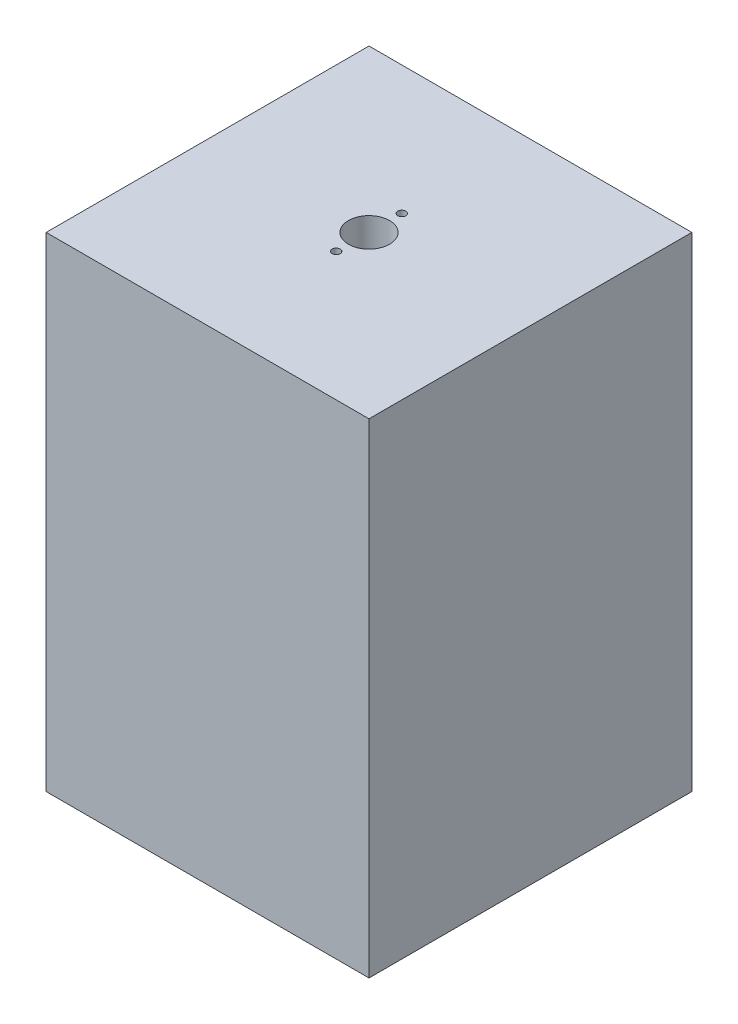
ISO-10303-21;
HEADER;
FILE_DESCRIPTION(('STEP AP214'),'2;1');
FILE_NAME('part.step','',(''),(''),'','','');
FILE_SCHEMA(('AUTOMOTIVE_DESIGN { 1 0 10303 214 1 1 1 1 }'));
ENDSEC;
DATA;
#1=APPLICATION_CONTEXT('core data for automotive mechanical design processes');
#2=APPLICATION_PROTOCOL_DEFINITION('international standard','automotive_design',2000,#1);
#3=PRODUCT_CONTEXT('',#1,'mechanical');
#4=PRODUCT('Part','Part','',(#3));
#5=PRODUCT_RELATED_PRODUCT_CATEGORY('part','',(#4));
#6=PRODUCT_DEFINITION_FORMATION('','',#4);
#7=PRODUCT_DEFINITION_CONTEXT('part definition',#1,'design');
#8=PRODUCT_DEFINITION('design','',#6,#7);
#9=PRODUCT_DEFINITION_SHAPE('','',#8);
#10=(LENGTH_UNIT() NAMED_UNIT(*) SI_UNIT(.MILLI.,.METRE.));
#11=(NAMED_UNIT(*) PLANE_ANGLE_UNIT() SI_UNIT($,.RADIAN.));
#12=(NAMED_UNIT(*) SI_UNIT($,.STERADIAN.) SOLID_ANGLE_UNIT());
#13=UNCERTAINTY_MEASURE_WITH_UNIT(LENGTH_MEASURE(1.E-05),#10,'distance_accuracy_value','');
#14=(GEOMETRIC_REPRESENTATION_CONTEXT(3) GLOBAL_UNCERTAINTY_ASSIGNED_CONTEXT((#13)) GLOBAL_UNIT_ASSIGNED_CONTEXT((#10,
#11,#12)) REPRESENTATION_CONTEXT('',''));
#15=CARTESIAN_POINT('',(0.,0.,0.));
#16=DIRECTION('',(0.,0.,1.));
#17=DIRECTION('',(1.,0.,0.));
#18=AXIS2_PLACEMENT_3D('',#15,#16,#17);
#19=CARTESIAN_POINT('',(50.8,76.2,50.8));
#20=DIRECTION('',(-1.,0.,0.));
#21=DIRECTION('',(0.,0.,1.));
#22=AXIS2_PLACEMENT_3D('',#19,#20,#21);
#23=PLANE('',#22);
#24=DIRECTION('',(0.,0.,-1.));
#25=VECTOR('',#24,1.);
#26=CARTESIAN_POINT('',(50.8,-76.2,50.8));
#27=LINE('',#26,#25);
#28=CARTESIAN_POINT('',(50.8,-76.2,50.8));
#29=VERTEX_POINT('',#28);
#30=CARTESIAN_POINT('',(50.8,-76.2,-50.8));
#31=VERTEX_POINT('',#30);
#32=EDGE_CURVE('E96',#29,#31,#27,.T.);
#33=ORIENTED_EDGE('',*,*,#32,.T.);
#34=DIRECTION('',(0.,-1.,0.));
#35=VECTOR('',#34,1.);
#36=CARTESIAN_POINT('',(50.8,76.2,-50.8));
#37=LINE('',#36,#35);
#38=CARTESIAN_POINT('',(50.8,76.2,-50.8));
#39=VERTEX_POINT('',#38);
#40=EDGE_CURVE('E11',#39,#31,#37,.T.);
#41=ORIENTED_EDGE('',*,*,#40,.F.);
#42=DIRECTION('',(0.,0.,-1.));
#43=VECTOR('',#42,1.);
#44=CARTESIAN_POINT('',(50.8,76.2,50.8));
#45=LINE('',#44,#43);
#46=CARTESIAN_POINT('',(50.8,76.2,50.8));
#47=VERTEX_POINT('',#46);
#48=EDGE_CURVE('E84',#47,#39,#45,.T.);
#49=ORIENTED_EDGE('',*,*,#48,.F.);
#50=DIRECTION('',(0.,-1.,0.));
#51=VECTOR('',#50,1.);
#52=CARTESIAN_POINT('',(50.8,76.2,50.8));
#53=LINE('',#52,#51);
#54=EDGE_CURVE('E92',#47,#29,#53,.T.);
#55=ORIENTED_EDGE('',*,*,#54,.T.);
#56=EDGE_LOOP('',(#33,#41,#49,#55));
#57=FACE_BOUND('',#56,.T.);
#58=ADVANCED_FACE('F33',(#57),#23,.F.);
#59=CARTESIAN_POINT('',(-50.8,76.2,-50.8));
#60=DIRECTION('',(0.,0.,1.));
#61=DIRECTION('',(1.,0.,0.));
#62=AXIS2_PLACEMENT_3D('',#59,#60,#61);
#63=PLANE('',#62);
#64=DIRECTION('',(-1.,0.,0.));
#65=VECTOR('',#64,1.);
#66=CARTESIAN_POINT('',(-50.8,-76.2,-50.8));
#67=LINE('',#66,#65);
#68=CARTESIAN_POINT('',(-50.8,-76.2,-50.8));
#69=VERTEX_POINT('',#68);
#70=EDGE_CURVE('E88',#31,#69,#67,.T.);
#71=ORIENTED_EDGE('',*,*,#70,.T.);
#72=DIRECTION('',(0.,-1.,0.));
#73=VECTOR('',#72,1.);
#74=CARTESIAN_POINT('',(-50.8,76.2,-50.8));
#75=LINE('',#74,#73);
#76=CARTESIAN_POINT('',(-50.8,76.2,-50.8));
#77=VERTEX_POINT('',#76);
#78=EDGE_CURVE('E41',#77,#69,#75,.T.);
#79=ORIENTED_EDGE('',*,*,#78,.F.);
#80=DIRECTION('',(-1.,0.,0.));
#81=VECTOR('',#80,1.);
#82=CARTESIAN_POINT('',(-50.8,76.2,-50.8));
#83=LINE('',#82,#81);
#84=EDGE_CURVE('E79',#39,#77,#83,.T.);
#85=ORIENTED_EDGE('',*,*,#84,.F.);
#86=ORIENTED_EDGE('',*,*,#40,.T.);
#87=EDGE_LOOP('',(#71,#79,#85,#86));
#88=FACE_BOUND('',#87,.T.);
#89=ADVANCED_FACE('F87',(#88),#63,.F.);
#90=CARTESIAN_POINT('',(-50.8,76.2,50.8));
#91=DIRECTION('',(1.,0.,0.));
#92=DIRECTION('',(0.,0.,-1.));
#93=AXIS2_PLACEMENT_3D('',#90,#91,#92);
#94=PLANE('',#93);
#95=DIRECTION('',(0.,0.,1.));
#96=VECTOR('',#95,1.);
#97=CARTESIAN_POINT('',(-50.8,-76.2,50.8));
#98=LINE('',#97,#96);
#99=CARTESIAN_POINT('',(-50.8,-76.2,50.8));
#100=VERTEX_POINT('',#99);
#101=EDGE_CURVE('E66',#69,#100,#98,.T.);
#102=ORIENTED_EDGE('',*,*,#101,.T.);
#103=DIRECTION('',(0.,-1.,0.));
#104=VECTOR('',#103,1.);
#105=CARTESIAN_POINT('',(-50.8,76.2,50.8));
#106=LINE('',#105,#104);
#107=CARTESIAN_POINT('',(-50.8,76.2,50.8));
#108=VERTEX_POINT('',#107);
#109=EDGE_CURVE('E89',#108,#100,#106,.T.);
#110=ORIENTED_EDGE('',*,*,#109,.F.);
#111=DIRECTION('',(0.,0.,1.));
#112=VECTOR('',#111,1.);
#113=CARTESIAN_POINT('',(-50.8,76.2,50.8));
#114=LINE('',#113,#112);
#115=EDGE_CURVE('E82',#77,#108,#114,.T.);
#116=ORIENTED_EDGE('',*,*,#115,.F.);
#117=ORIENTED_EDGE('',*,*,#78,.T.);
#118=EDGE_LOOP('',(#102,#110,#116,#117));
#119=FACE_BOUND('',#118,.T.);
#120=ADVANCED_FACE('F90',(#119),#94,.F.);
#121=CARTESIAN_POINT('',(-50.8,76.2,50.8));
#122=DIRECTION('',(0.,0.,-1.));
#123=DIRECTION('',(-1.,0.,0.));
#124=AXIS2_PLACEMENT_3D('',#121,#122,#123);
#125=PLANE('',#124);
#126=DIRECTION('',(1.,0.,0.));
#127=VECTOR('',#126,1.);
#128=CARTESIAN_POINT('',(-50.8,-76.2,50.8));
#129=LINE('',#128,#127);
#130=EDGE_CURVE('E72',#100,#29,#129,.T.);
#131=ORIENTED_EDGE('',*,*,#130,.T.);
#132=ORIENTED_EDGE('',*,*,#54,.F.);
#133=DIRECTION('',(1.,0.,0.));
#134=VECTOR('',#133,1.);
#135=CARTESIAN_POINT('',(-50.8,76.2,50.8));
#136=LINE('',#135,#134);
#137=EDGE_CURVE('E49',#108,#47,#136,.T.);
#138=ORIENTED_EDGE('',*,*,#137,.F.);
#139=ORIENTED_EDGE('',*,*,#109,.T.);
#140=EDGE_LOOP('',(#131,#132,#138,#139));
#141=FACE_BOUND('',#140,.T.);
#142=ADVANCED_FACE('F104',(#141),#125,.F.);
#143=CARTESIAN_POINT('',(0.,76.2,0.));
#144=DIRECTION('',(0.,-1.,0.));
#145=DIRECTION('',(0.,0.,-1.));
#146=AXIS2_PLACEMENT_3D('',#143,#144,#145);
#147=PLANE('',#146);
#148=CARTESIAN_POINT('',(0.,76.2,-10.3251));
#149=DIRECTION('',(0.,1.,0.));
#150=DIRECTION('',(0.,0.,1.));
#151=AXIS2_PLACEMENT_3D('',#148,#149,#150);
#152=CIRCLE('',#151,1.27);
#153=CARTESIAN_POINT('',(0.,76.2,-9.0551));
#154=VERTEX_POINT('',#153);
#155=EDGE_CURVE('E122',#154,#154,#152,.T.);
#156=ORIENTED_EDGE('',*,*,#155,.F.);
#157=EDGE_LOOP('',(#156));
#158=FACE_BOUND('',#157,.T.);
#159=CARTESIAN_POINT('',(0.,76.2,10.3251));
#160=DIRECTION('',(0.,1.,0.));
#161=DIRECTION('',(0.,0.,1.));
#162=AXIS2_PLACEMENT_3D('',#159,#160,#161);
#163=CIRCLE('',#162,1.27);
#164=CARTESIAN_POINT('',(0.,76.2,11.5951));
#165=VERTEX_POINT('',#164);
#166=EDGE_CURVE('E116',#165,#165,#163,.T.);
#167=ORIENTED_EDGE('',*,*,#166,.F.);
#168=EDGE_LOOP('',(#167));
#169=FACE_BOUND('',#168,.T.);
#170=CARTESIAN_POINT('',(0.,76.2,0.));
#171=DIRECTION('',(0.,1.,0.));
#172=DIRECTION('',(0.,0.,1.));
#173=AXIS2_PLACEMENT_3D('',#170,#171,#172);
#174=CIRCLE('',#173,6.477);
#175=CARTESIAN_POINT('',(0.,76.2,6.477));
#176=VERTEX_POINT('',#175);
#177=EDGE_CURVE('E110',#176,#176,#174,.T.);
#178=ORIENTED_EDGE('',*,*,#177,.F.);
#179=EDGE_LOOP('',(#178));
#180=FACE_BOUND('',#179,.T.);
#181=ORIENTED_EDGE('',*,*,#48,.T.);
#182=ORIENTED_EDGE('',*,*,#84,.T.);
#183=ORIENTED_EDGE('',*,*,#115,.T.);
#184=ORIENTED_EDGE('',*,*,#137,.T.);
#185=EDGE_LOOP('',(#181,#182,#183,#184));
#186=FACE_BOUND('',#185,.T.);
#187=ADVANCED_FACE('F80',(#158,#169,#180,#186),#147,.F.);
#188=CARTESIAN_POINT('',(0.,-76.2,0.));
#189=DIRECTION('',(0.,-1.,0.));
#190=DIRECTION('',(0.,0.,-1.));
#191=AXIS2_PLACEMENT_3D('',#188,#189,#190);
#192=PLANE('',#191);
#193=ORIENTED_EDGE('',*,*,#32,.F.);
#194=ORIENTED_EDGE('',*,*,#130,.F.);
#195=ORIENTED_EDGE('',*,*,#101,.F.);
#196=ORIENTED_EDGE('',*,*,#70,.F.);
#197=EDGE_LOOP('',(#193,#194,#195,#196));
#198=FACE_BOUND('',#197,.T.);
#199=ADVANCED_FACE('F107',(#198),#192,.T.);
#200=CARTESIAN_POINT('',(0.,63.5,0.));
#201=DIRECTION('',(0.,1.,0.));
#202=DIRECTION('',(0.,0.,1.));
#203=AXIS2_PLACEMENT_3D('',#200,#201,#202);
#204=CYLINDRICAL_SURFACE('',#203,6.477);
#205=CARTESIAN_POINT('',(0.,63.5,0.));
#206=DIRECTION('',(0.,1.,0.));
#207=DIRECTION('',(0.,0.,1.));
#208=AXIS2_PLACEMENT_3D('',#205,#206,#207);
#209=CIRCLE('',#208,6.477);
#210=CARTESIAN_POINT('',(0.,63.5,6.477));
#211=VERTEX_POINT('',#210);
#212=EDGE_CURVE('E99',#211,#211,#209,.T.);
#213=ORIENTED_EDGE('',*,*,#212,.F.);
#214=EDGE_LOOP('',(#213));
#215=FACE_BOUND('',#214,.T.);
#216=ORIENTED_EDGE('',*,*,#177,.T.);
#217=EDGE_LOOP('',(#216));
#218=FACE_BOUND('',#217,.T.);
#219=ADVANCED_FACE('F144',(#215,#218),#204,.F.);
#220=CARTESIAN_POINT('',(0.,63.5,0.));
#221=DIRECTION('',(0.,1.,0.));
#222=DIRECTION('',(0.,0.,1.));
#223=AXIS2_PLACEMENT_3D('',#220,#221,#222);
#224=PLANE('',#223);
#225=ORIENTED_EDGE('',*,*,#212,.T.);
#226=EDGE_LOOP('',(#225));
#227=FACE_BOUND('',#226,.T.);
#228=ADVANCED_FACE('F146',(#227),#224,.T.);
#229=CARTESIAN_POINT('',(0.,63.5,10.3251));
#230=DIRECTION('',(0.,1.,0.));
#231=DIRECTION('',(0.,0.,1.));
#232=AXIS2_PLACEMENT_3D('',#229,#230,#231);
#233=CYLINDRICAL_SURFACE('',#232,1.27);
#234=CARTESIAN_POINT('',(0.,63.5,10.3251));
#235=DIRECTION('',(0.,1.,0.));
#236=DIRECTION('',(0.,0.,1.));
#237=AXIS2_PLACEMENT_3D('',#234,#235,#236);
#238=CIRCLE('',#237,1.27);
#239=CARTESIAN_POINT('',(0.,63.5,11.5951));
#240=VERTEX_POINT('',#239);
#241=EDGE_CURVE('E119',#240,#240,#238,.T.);
#242=ORIENTED_EDGE('',*,*,#241,.F.);
#243=EDGE_LOOP('',(#242));
#244=FACE_BOUND('',#243,.T.);
#245=ORIENTED_EDGE('',*,*,#166,.T.);
#246=EDGE_LOOP('',(#245));
#247=FACE_BOUND('',#246,.T.);
#248=ADVANCED_FACE('F153',(#244,#247),#233,.F.);
#249=CARTESIAN_POINT('',(0.,63.5,10.3251));
#250=DIRECTION('',(0.,1.,0.));
#251=DIRECTION('',(0.,0.,1.));
#252=AXIS2_PLACEMENT_3D('',#249,#250,#251);
#253=PLANE('',#252);
#254=ORIENTED_EDGE('',*,*,#241,.T.);
#255=EDGE_LOOP('',(#254));
#256=FACE_BOUND('',#255,.T.);
#257=ADVANCED_FACE('F133',(#256),#253,.T.);
#258=CARTESIAN_POINT('',(0.,63.5,-10.3251));
#259=DIRECTION('',(0.,1.,0.));
#260=DIRECTION('',(0.,0.,1.));
#261=AXIS2_PLACEMENT_3D('',#258,#259,#260);
#262=CYLINDRICAL_SURFACE('',#261,1.27);
#263=CARTESIAN_POINT('',(0.,63.5,-10.3251));
#264=DIRECTION('',(0.,1.,0.));
#265=DIRECTION('',(0.,0.,1.));
#266=AXIS2_PLACEMENT_3D('',#263,#264,#265);
#267=CIRCLE('',#266,1.27);
#268=CARTESIAN_POINT('',(0.,63.5,-9.0551));
#269=VERTEX_POINT('',#268);
#270=EDGE_CURVE('E113',#269,#269,#267,.T.);
#271=ORIENTED_EDGE('',*,*,#270,.F.);
#272=EDGE_LOOP('',(#271));
#273=FACE_BOUND('',#272,.T.);
#274=ORIENTED_EDGE('',*,*,#155,.T.);
#275=EDGE_LOOP('',(#274));
#276=FACE_BOUND('',#275,.T.);
#277=ADVANCED_FACE('F130',(#273,#276),#262,.F.);
#278=CARTESIAN_POINT('',(0.,63.5,-10.3251));
#279=DIRECTION('',(0.,1.,0.));
#280=DIRECTION('',(0.,0.,1.));
#281=AXIS2_PLACEMENT_3D('',#278,#279,#280);
#282=PLANE('',#281);
#283=ORIENTED_EDGE('',*,*,#270,.T.);
#284=EDGE_LOOP('',(#283));
#285=FACE_BOUND('',#284,.T.);
#286=ADVANCED_FACE('F128',(#285),#282,.T.);
#287=CLOSED_SHELL('',(#58,#89,#120,#142,#187,#199,#219,#228,#248,#257,#277,#286));
#288=MANIFOLD_SOLID_BREP('B2',#287);
#289=ADVANCED_BREP_SHAPE_REPRESENTATION('',(#18,#288),#14);
#290=SHAPE_DEFINITION_REPRESENTATION(#9,#289);
ENDSEC;
END-ISO-10303-21;
